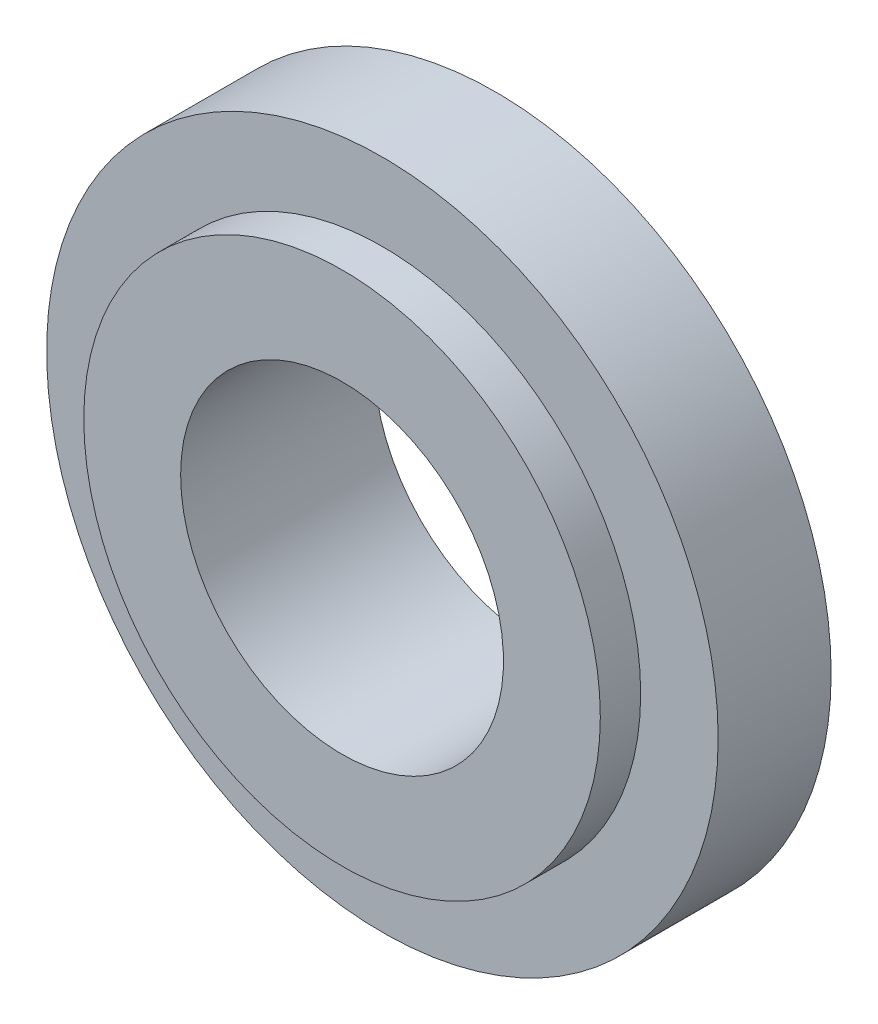
ISO-10303-21;
HEADER;
FILE_DESCRIPTION(('STEP AP214'),'2;1');
FILE_NAME('part.step','',(''),(''),'','','');
FILE_SCHEMA(('AUTOMOTIVE_DESIGN { 1 0 10303 214 1 1 1 1 }'));
ENDSEC;
DATA;
#1=APPLICATION_CONTEXT('core data for automotive mechanical design processes');
#2=APPLICATION_PROTOCOL_DEFINITION('international standard','automotive_design',2000,#1);
#3=PRODUCT_CONTEXT('',#1,'mechanical');
#4=PRODUCT('Part','Part','',(#3));
#5=PRODUCT_RELATED_PRODUCT_CATEGORY('part','',(#4));
#6=PRODUCT_DEFINITION_FORMATION('','',#4);
#7=PRODUCT_DEFINITION_CONTEXT('part definition',#1,'design');
#8=PRODUCT_DEFINITION('design','',#6,#7);
#9=PRODUCT_DEFINITION_SHAPE('','',#8);
#10=(LENGTH_UNIT() NAMED_UNIT(*) SI_UNIT(.MILLI.,.METRE.));
#11=(NAMED_UNIT(*) PLANE_ANGLE_UNIT() SI_UNIT($,.RADIAN.));
#12=(NAMED_UNIT(*) SI_UNIT($,.STERADIAN.) SOLID_ANGLE_UNIT());
#13=UNCERTAINTY_MEASURE_WITH_UNIT(LENGTH_MEASURE(1.E-05),#10,'distance_accuracy_value','');
#14=(GEOMETRIC_REPRESENTATION_CONTEXT(3) GLOBAL_UNCERTAINTY_ASSIGNED_CONTEXT((#13)) GLOBAL_UNIT_ASSIGNED_CONTEXT((#10,
#11,#12)) REPRESENTATION_CONTEXT('',''));
#15=CARTESIAN_POINT('',(0.,0.,0.));
#16=DIRECTION('',(0.,0.,1.));
#17=DIRECTION('',(1.,0.,0.));
#18=AXIS2_PLACEMENT_3D('',#15,#16,#17);
#19=CARTESIAN_POINT('',(0.,0.,9.525));
#20=DIRECTION('',(0.,0.,-1.));
#21=DIRECTION('',(-1.,0.,0.));
#22=AXIS2_PLACEMENT_3D('',#19,#20,#21);
#23=CYLINDRICAL_SURFACE('',#22,12.7);
#24=CARTESIAN_POINT('',(0.,0.,0.));
#25=DIRECTION('',(0.,0.,1.));
#26=DIRECTION('',(1.,0.,0.));
#27=AXIS2_PLACEMENT_3D('',#24,#25,#26);
#28=CIRCLE('',#27,12.7);
#29=CARTESIAN_POINT('',(-12.7,0.,0.));
#30=VERTEX_POINT('',#29);
#31=EDGE_CURVE('E41',#30,#30,#28,.T.);
#32=CARTESIAN_POINT('',(0.,0.,1.984375));
#33=DIRECTION('',(0.,0.,1.));
#34=DIRECTION('',(1.,0.,0.));
#35=AXIS2_PLACEMENT_3D('',#32,#33,#34);
#36=CIRCLE('',#35,12.7);
#37=CARTESIAN_POINT('',(-12.7,0.,1.984375));
#38=VERTEX_POINT('',#37);
#39=EDGE_CURVE('E10',#38,#38,#36,.T.);
#40=CARTESIAN_POINT('',(-12.7,0.,0.));
#41=CARTESIAN_POINT('',(-12.7,0.,0.0206705729166665));
#42=CARTESIAN_POINT('',(-12.7,0.,0.041341145833333));
#43=CARTESIAN_POINT('',(-12.7,0.,0.0826822916666665));
#44=CARTESIAN_POINT('',(-12.7,0.,0.103352864583334));
#45=CARTESIAN_POINT('',(-12.7,0.,0.144694010416667));
#46=CARTESIAN_POINT('',(-12.7,0.,0.165364583333334));
#47=CARTESIAN_POINT('',(-12.7,0.,0.206705729166667));
#48=CARTESIAN_POINT('',(-12.7,0.,0.227376302083333));
#49=CARTESIAN_POINT('',(-12.7,0.,0.268717447916667));
#50=CARTESIAN_POINT('',(-12.7,0.,0.289388020833334));
#51=CARTESIAN_POINT('',(-12.7,0.,0.330729166666667));
#52=CARTESIAN_POINT('',(-12.7,0.,0.351399739583334));
#53=CARTESIAN_POINT('',(-12.7,0.,0.392740885416667));
#54=CARTESIAN_POINT('',(-12.7,0.,0.413411458333333));
#55=CARTESIAN_POINT('',(-12.7,0.,0.454752604166666));
#56=CARTESIAN_POINT('',(-12.7,0.,0.475423177083333));
#57=CARTESIAN_POINT('',(-12.7,0.,0.516764322916666));
#58=CARTESIAN_POINT('',(-12.7,0.,0.537434895833333));
#59=CARTESIAN_POINT('',(-12.7,0.,0.578776041666667));
#60=CARTESIAN_POINT('',(-12.7,0.,0.599446614583333));
#61=CARTESIAN_POINT('',(-12.7,0.,0.640787760416666));
#62=CARTESIAN_POINT('',(-12.7,0.,0.661458333333333));
#63=CARTESIAN_POINT('',(-12.7,0.,0.702799479166666));
#64=CARTESIAN_POINT('',(-12.7,0.,0.723470052083333));
#65=CARTESIAN_POINT('',(-12.7,0.,0.764811197916667));
#66=CARTESIAN_POINT('',(-12.7,0.,0.785481770833333));
#67=CARTESIAN_POINT('',(-12.7,0.,0.826822916666666));
#68=CARTESIAN_POINT('',(-12.7,0.,0.847493489583333));
#69=CARTESIAN_POINT('',(-12.7,0.,0.888834635416666));
#70=CARTESIAN_POINT('',(-12.7,0.,0.909505208333333));
#71=CARTESIAN_POINT('',(-12.7,0.,0.950846354166667));
#72=CARTESIAN_POINT('',(-12.7,0.,0.971516927083334));
#73=CARTESIAN_POINT('',(-12.7,0.,1.01285807291667));
#74=CARTESIAN_POINT('',(-12.7,0.,1.03352864583333));
#75=CARTESIAN_POINT('',(-12.7,0.,1.07486979166667));
#76=CARTESIAN_POINT('',(-12.7,0.,1.09554036458333));
#77=CARTESIAN_POINT('',(-12.7,0.,1.13688151041667));
#78=CARTESIAN_POINT('',(-12.7,0.,1.15755208333333));
#79=CARTESIAN_POINT('',(-12.7,0.,1.19889322916667));
#80=CARTESIAN_POINT('',(-12.7,0.,1.21956380208333));
#81=CARTESIAN_POINT('',(-12.7,0.,1.26090494791667));
#82=CARTESIAN_POINT('',(-12.7,0.,1.28157552083333));
#83=CARTESIAN_POINT('',(-12.7,0.,1.32291666666667));
#84=CARTESIAN_POINT('',(-12.7,0.,1.34358723958333));
#85=CARTESIAN_POINT('',(-12.7,0.,1.38492838541667));
#86=CARTESIAN_POINT('',(-12.7,0.,1.40559895833333));
#87=CARTESIAN_POINT('',(-12.7,0.,1.44694010416667));
#88=CARTESIAN_POINT('',(-12.7,0.,1.46761067708333));
#89=CARTESIAN_POINT('',(-12.7,0.,1.50895182291667));
#90=CARTESIAN_POINT('',(-12.7,0.,1.52962239583333));
#91=CARTESIAN_POINT('',(-12.7,0.,1.57096354166667));
#92=CARTESIAN_POINT('',(-12.7,0.,1.59163411458333));
#93=CARTESIAN_POINT('',(-12.7,0.,1.63297526041667));
#94=CARTESIAN_POINT('',(-12.7,0.,1.65364583333333));
#95=CARTESIAN_POINT('',(-12.7,0.,1.69498697916667));
#96=CARTESIAN_POINT('',(-12.7,0.,1.71565755208333));
#97=CARTESIAN_POINT('',(-12.7,0.,1.75699869791667));
#98=CARTESIAN_POINT('',(-12.7,0.,1.77766927083333));
#99=CARTESIAN_POINT('',(-12.7,0.,1.81901041666667));
#100=CARTESIAN_POINT('',(-12.7,0.,1.83968098958333));
#101=CARTESIAN_POINT('',(-12.7,0.,1.88102213541667));
#102=CARTESIAN_POINT('',(-12.7,0.,1.90169270833333));
#103=CARTESIAN_POINT('',(-12.7,0.,1.94303385416667));
#104=CARTESIAN_POINT('',(-12.7,0.,1.96370442708333));
#105=CARTESIAN_POINT('',(-12.7,0.,1.984375));
#106=B_SPLINE_CURVE_WITH_KNOTS('',3,(#40,#41,#42,#43,#44,#45,#46,#47,#48,#49,#50,#51,#52,#53,
#54,#55,#56,#57,#58,#59,#60,#61,#62,#63,#64,#65,#66,#67,#68,#69,#70,#71,#72,#73,#74,#75,#76,#77,
#78,#79,#80,#81,#82,#83,#84,#85,#86,#87,#88,#89,#90,#91,#92,#93,#94,#95,#96,#97,#98,#99,#100,
#101,#102,#103,#104,#105),.UNSPECIFIED.,.F.,.F.,(4,2,2,2,2,2,2,2,2,2,2,2,2,2,2,2,2,2,2,2,2,2,2,
2,2,2,2,2,2,2,2,2,4),(0.,0.0620117187499995,0.124023437500001,0.18603515625,0.248046875,
0.310058593750001,0.3720703125,0.43408203125,0.496093749999999,0.55810546875,0.6201171875,
0.682128906249999,0.744140625,0.80615234375,0.868164062499999,0.930175781250001,0.9921875,
1.05419921875,1.1162109375,1.17822265625,1.240234375,1.30224609375,1.3642578125,1.42626953125,
1.48828125,1.55029296875,1.6123046875,1.67431640625,1.736328125,1.79833984375,1.8603515625,
1.92236328125,1.984375),.UNSPECIFIED.);
#107=EDGE_CURVE('BSEAM37',#30,#38,#106,.T.);
#108=ORIENTED_EDGE('',*,*,#31,.T.);
#109=ORIENTED_EDGE('',*,*,#39,.F.);
#110=ORIENTED_EDGE('',*,*,#107,.T.);
#111=ORIENTED_EDGE('',*,*,#107,.F.);
#112=EDGE_LOOP('',(#108,#110,#109,#111));
#113=FACE_BOUND('',#112,.T.);
#114=ADVANCED_FACE('F37',(#113),#23,.T.);
#115=CARTESIAN_POINT('',(0.,0.,9.525));
#116=DIRECTION('',(0.,0.,1.));
#117=DIRECTION('',(1.,0.,0.));
#118=AXIS2_PLACEMENT_3D('',#115,#116,#117);
#119=PLANE('',#118);
#120=CARTESIAN_POINT('',(0.,0.,9.525));
#121=DIRECTION('',(0.,0.,1.));
#122=DIRECTION('',(1.,0.,0.));
#123=AXIS2_PLACEMENT_3D('',#120,#121,#122);
#124=CIRCLE('',#123,12.7);
#125=CARTESIAN_POINT('',(-12.7,0.,9.525));
#126=VERTEX_POINT('',#125);
#127=EDGE_CURVE('E45',#126,#126,#124,.T.);
#128=ORIENTED_EDGE('',*,*,#127,.T.);
#129=EDGE_LOOP('',(#128));
#130=FACE_BOUND('',#129,.T.);
#131=CARTESIAN_POINT('',(0.,0.,9.525));
#132=DIRECTION('',(0.,0.,1.));
#133=DIRECTION('',(1.,0.,0.));
#134=AXIS2_PLACEMENT_3D('',#131,#132,#133);
#135=CIRCLE('',#134,7.9375);
#136=CARTESIAN_POINT('',(-7.9375,0.,9.525));
#137=VERTEX_POINT('',#136);
#138=EDGE_CURVE('E59',#137,#137,#135,.T.);
#139=ORIENTED_EDGE('',*,*,#138,.F.);
#140=EDGE_LOOP('',(#139));
#141=FACE_BOUND('',#140,.T.);
#142=ADVANCED_FACE('F83',(#130,#141),#119,.T.);
#143=CARTESIAN_POINT('',(0.,0.,0.));
#144=DIRECTION('',(0.,0.,1.));
#145=DIRECTION('',(1.,0.,0.));
#146=AXIS2_PLACEMENT_3D('',#143,#144,#145);
#147=PLANE('',#146);
#148=ORIENTED_EDGE('',*,*,#31,.F.);
#149=EDGE_LOOP('',(#148));
#150=FACE_BOUND('',#149,.T.);
#151=CARTESIAN_POINT('',(0.,0.,0.));
#152=DIRECTION('',(0.,0.,1.));
#153=DIRECTION('',(1.,0.,0.));
#154=AXIS2_PLACEMENT_3D('',#151,#152,#153);
#155=CIRCLE('',#154,7.9375);
#156=CARTESIAN_POINT('',(-7.9375,0.,0.));
#157=VERTEX_POINT('',#156);
#158=EDGE_CURVE('E57',#157,#157,#155,.T.);
#159=ORIENTED_EDGE('',*,*,#158,.T.);
#160=EDGE_LOOP('',(#159));
#161=FACE_BOUND('',#160,.T.);
#162=ADVANCED_FACE('F65',(#150,#161),#147,.F.);
#163=CARTESIAN_POINT('',(0.,0.,7.540625));
#164=DIRECTION('',(0.,0.,1.));
#165=DIRECTION('',(1.,0.,0.));
#166=AXIS2_PLACEMENT_3D('',#163,#164,#165);
#167=CIRCLE('',#166,12.7);
#168=CARTESIAN_POINT('',(-12.7,0.,7.540625));
#169=VERTEX_POINT('',#168);
#170=EDGE_CURVE('E54',#169,#169,#167,.T.);
#171=CARTESIAN_POINT('',(-12.7,0.,7.540625));
#172=CARTESIAN_POINT('',(-12.7,0.,7.56129557291667));
#173=CARTESIAN_POINT('',(-12.7,0.,7.58196614583333));
#174=CARTESIAN_POINT('',(-12.7,0.,7.62330729166667));
#175=CARTESIAN_POINT('',(-12.7,0.,7.64397786458333));
#176=CARTESIAN_POINT('',(-12.7,0.,7.68531901041667));
#177=CARTESIAN_POINT('',(-12.7,0.,7.70598958333333));
#178=CARTESIAN_POINT('',(-12.7,0.,7.74733072916667));
#179=CARTESIAN_POINT('',(-12.7,0.,7.76800130208333));
#180=CARTESIAN_POINT('',(-12.7,0.,7.80934244791667));
#181=CARTESIAN_POINT('',(-12.7,0.,7.83001302083333));
#182=CARTESIAN_POINT('',(-12.7,0.,7.87135416666667));
#183=CARTESIAN_POINT('',(-12.7,0.,7.89202473958333));
#184=CARTESIAN_POINT('',(-12.7,0.,7.93336588541667));
#185=CARTESIAN_POINT('',(-12.7,0.,7.95403645833333));
#186=CARTESIAN_POINT('',(-12.7,0.,7.99537760416667));
#187=CARTESIAN_POINT('',(-12.7,0.,8.01604817708333));
#188=CARTESIAN_POINT('',(-12.7,0.,8.05738932291666));
#189=CARTESIAN_POINT('',(-12.7,0.,8.07805989583333));
#190=CARTESIAN_POINT('',(-12.7,0.,8.11940104166667));
#191=CARTESIAN_POINT('',(-12.7,0.,8.14007161458333));
#192=CARTESIAN_POINT('',(-12.7,0.,8.18141276041667));
#193=CARTESIAN_POINT('',(-12.7,0.,8.20208333333333));
#194=CARTESIAN_POINT('',(-12.7,0.,8.24342447916667));
#195=CARTESIAN_POINT('',(-12.7,0.,8.26409505208333));
#196=CARTESIAN_POINT('',(-12.7,0.,8.30543619791667));
#197=CARTESIAN_POINT('',(-12.7,0.,8.32610677083333));
#198=CARTESIAN_POINT('',(-12.7,0.,8.36744791666667));
#199=CARTESIAN_POINT('',(-12.7,0.,8.38811848958333));
#200=CARTESIAN_POINT('',(-12.7,0.,8.42945963541667));
#201=CARTESIAN_POINT('',(-12.7,0.,8.45013020833333));
#202=CARTESIAN_POINT('',(-12.7,0.,8.49147135416667));
#203=CARTESIAN_POINT('',(-12.7,0.,8.51214192708333));
#204=CARTESIAN_POINT('',(-12.7,0.,8.55348307291667));
#205=CARTESIAN_POINT('',(-12.7,0.,8.57415364583333));
#206=CARTESIAN_POINT('',(-12.7,0.,8.61549479166667));
#207=CARTESIAN_POINT('',(-12.7,0.,8.63616536458333));
#208=CARTESIAN_POINT('',(-12.7,0.,8.67750651041667));
#209=CARTESIAN_POINT('',(-12.7,0.,8.69817708333333));
#210=CARTESIAN_POINT('',(-12.7,0.,8.73951822916667));
#211=CARTESIAN_POINT('',(-12.7,0.,8.76018880208333));
#212=CARTESIAN_POINT('',(-12.7,0.,8.80152994791667));
#213=CARTESIAN_POINT('',(-12.7,0.,8.82220052083333));
#214=CARTESIAN_POINT('',(-12.7,0.,8.86354166666666));
#215=CARTESIAN_POINT('',(-12.7,0.,8.88421223958333));
#216=CARTESIAN_POINT('',(-12.7,0.,8.92555338541667));
#217=CARTESIAN_POINT('',(-12.7,0.,8.94622395833333));
#218=CARTESIAN_POINT('',(-12.7,0.,8.98756510416667));
#219=CARTESIAN_POINT('',(-12.7,0.,9.00823567708333));
#220=CARTESIAN_POINT('',(-12.7,0.,9.04957682291666));
#221=CARTESIAN_POINT('',(-12.7,0.,9.07024739583333));
#222=CARTESIAN_POINT('',(-12.7,0.,9.11158854166667));
#223=CARTESIAN_POINT('',(-12.7,0.,9.13225911458333));
#224=CARTESIAN_POINT('',(-12.7,0.,9.17360026041667));
#225=CARTESIAN_POINT('',(-12.7,0.,9.19427083333333));
#226=CARTESIAN_POINT('',(-12.7,0.,9.23561197916667));
#227=CARTESIAN_POINT('',(-12.7,0.,9.25628255208333));
#228=CARTESIAN_POINT('',(-12.7,0.,9.29762369791667));
#229=CARTESIAN_POINT('',(-12.7,0.,9.31829427083333));
#230=CARTESIAN_POINT('',(-12.7,0.,9.35963541666667));
#231=CARTESIAN_POINT('',(-12.7,0.,9.38030598958333));
#232=CARTESIAN_POINT('',(-12.7,0.,9.42164713541667));
#233=CARTESIAN_POINT('',(-12.7,0.,9.44231770833333));
#234=CARTESIAN_POINT('',(-12.7,0.,9.48365885416667));
#235=CARTESIAN_POINT('',(-12.7,0.,9.50432942708333));
#236=CARTESIAN_POINT('',(-12.7,0.,9.525));
#237=B_SPLINE_CURVE_WITH_KNOTS('',3,(#171,#172,#173,#174,#175,#176,#177,#178,#179,#180,#181,
#182,#183,#184,#185,#186,#187,#188,#189,#190,#191,#192,#193,#194,#195,#196,#197,#198,#199,#200,
#201,#202,#203,#204,#205,#206,#207,#208,#209,#210,#211,#212,#213,#214,#215,#216,#217,#218,#219,
#220,#221,#222,#223,#224,#225,#226,#227,#228,#229,#230,#231,#232,#233,#234,#235,#236),
.UNSPECIFIED.,.F.,.F.,(4,2,2,2,2,2,2,2,2,2,2,2,2,2,2,2,2,2,2,2,2,2,2,2,2,2,2,2,2,2,2,2,4),(0.,
0.0620117187499995,0.124023437499999,0.186035156249999,0.248046875,0.310058593749999,
0.372070312499999,0.43408203125,0.496093749999999,0.558105468749999,0.6201171875,
0.682128906249999,0.744140624999999,0.80615234375,0.868164062499999,0.930175781249999,0.9921875,
1.05419921875,1.1162109375,1.17822265625,1.240234375,1.30224609375,1.3642578125,1.42626953125,
1.48828125,1.55029296875,1.6123046875,1.67431640625,1.736328125,1.79833984375,1.8603515625,
1.92236328125,1.984375),.UNSPECIFIED.);
#238=EDGE_CURVE('BSEAM39',#169,#126,#237,.T.);
#239=ORIENTED_EDGE('',*,*,#170,.T.);
#240=ORIENTED_EDGE('',*,*,#127,.F.);
#241=ORIENTED_EDGE('',*,*,#238,.T.);
#242=ORIENTED_EDGE('',*,*,#238,.F.);
#243=EDGE_LOOP('',(#239,#241,#240,#242));
#244=FACE_BOUND('',#243,.T.);
#245=ADVANCED_FACE('F39',(#244),#23,.T.);
#246=CARTESIAN_POINT('',(0.,0.,9.525));
#247=DIRECTION('',(0.,0.,-1.));
#248=DIRECTION('',(-1.,0.,0.));
#249=AXIS2_PLACEMENT_3D('',#246,#247,#248);
#250=CYLINDRICAL_SURFACE('',#249,7.9375);
#251=CARTESIAN_POINT('',(-7.9375,0.,9.525));
#252=CARTESIAN_POINT('',(-7.9375,0.,9.42578125));
#253=CARTESIAN_POINT('',(-7.9375,0.,9.3265625));
#254=CARTESIAN_POINT('',(-7.9375,0.,9.128125));
#255=CARTESIAN_POINT('',(-7.9375,0.,9.02890625));
#256=CARTESIAN_POINT('',(-7.9375,0.,8.83046875));
#257=CARTESIAN_POINT('',(-7.9375,0.,8.73125));
#258=CARTESIAN_POINT('',(-7.9375,0.,8.5328125));
#259=CARTESIAN_POINT('',(-7.9375,0.,8.43359375));
#260=CARTESIAN_POINT('',(-7.9375,0.,8.23515625));
#261=CARTESIAN_POINT('',(-7.9375,0.,8.1359375));
#262=CARTESIAN_POINT('',(-7.9375,0.,7.9375));
#263=CARTESIAN_POINT('',(-7.9375,0.,7.83828125));
#264=CARTESIAN_POINT('',(-7.9375,0.,7.63984375));
#265=CARTESIAN_POINT('',(-7.9375,0.,7.540625));
#266=CARTESIAN_POINT('',(-7.9375,0.,7.3421875));
#267=CARTESIAN_POINT('',(-7.9375,0.,7.24296875));
#268=CARTESIAN_POINT('',(-7.9375,0.,7.04453125));
#269=CARTESIAN_POINT('',(-7.9375,0.,6.9453125));
#270=CARTESIAN_POINT('',(-7.9375,0.,6.746875));
#271=CARTESIAN_POINT('',(-7.9375,0.,6.64765625));
#272=CARTESIAN_POINT('',(-7.9375,0.,6.44921875));
#273=CARTESIAN_POINT('',(-7.9375,0.,6.35));
#274=CARTESIAN_POINT('',(-7.9375,0.,6.1515625));
#275=CARTESIAN_POINT('',(-7.9375,0.,6.05234375));
#276=CARTESIAN_POINT('',(-7.9375,0.,5.85390625));
#277=CARTESIAN_POINT('',(-7.9375,0.,5.7546875));
#278=CARTESIAN_POINT('',(-7.9375,0.,5.55625));
#279=CARTESIAN_POINT('',(-7.9375,0.,5.45703125));
#280=CARTESIAN_POINT('',(-7.9375,0.,5.25859375));
#281=CARTESIAN_POINT('',(-7.9375,0.,5.159375));
#282=CARTESIAN_POINT('',(-7.9375,0.,4.9609375));
#283=CARTESIAN_POINT('',(-7.9375,0.,4.86171875));
#284=CARTESIAN_POINT('',(-7.9375,0.,4.66328125));
#285=CARTESIAN_POINT('',(-7.9375,0.,4.5640625));
#286=CARTESIAN_POINT('',(-7.9375,0.,4.365625));
#287=CARTESIAN_POINT('',(-7.9375,0.,4.26640625));
#288=CARTESIAN_POINT('',(-7.9375,0.,4.06796875));
#289=CARTESIAN_POINT('',(-7.9375,0.,3.96875));
#290=CARTESIAN_POINT('',(-7.9375,0.,3.7703125));
#291=CARTESIAN_POINT('',(-7.9375,0.,3.67109375));
#292=CARTESIAN_POINT('',(-7.9375,0.,3.47265625));
#293=CARTESIAN_POINT('',(-7.9375,0.,3.3734375));
#294=CARTESIAN_POINT('',(-7.9375,0.,3.175));
#295=CARTESIAN_POINT('',(-7.9375,0.,3.07578125));
#296=CARTESIAN_POINT('',(-7.9375,0.,2.87734375));
#297=CARTESIAN_POINT('',(-7.9375,0.,2.778125));
#298=CARTESIAN_POINT('',(-7.9375,0.,2.5796875));
#299=CARTESIAN_POINT('',(-7.9375,0.,2.48046875));
#300=CARTESIAN_POINT('',(-7.9375,0.,2.28203125));
#301=CARTESIAN_POINT('',(-7.9375,0.,2.1828125));
#302=CARTESIAN_POINT('',(-7.9375,0.,1.984375));
#303=CARTESIAN_POINT('',(-7.9375,0.,1.88515625));
#304=CARTESIAN_POINT('',(-7.9375,0.,1.68671875));
#305=CARTESIAN_POINT('',(-7.9375,0.,1.5875));
#306=CARTESIAN_POINT('',(-7.9375,0.,1.3890625));
#307=CARTESIAN_POINT('',(-7.9375,0.,1.28984375));
#308=CARTESIAN_POINT('',(-7.9375,0.,1.09140625));
#309=CARTESIAN_POINT('',(-7.9375,0.,0.992187500000001));
#310=CARTESIAN_POINT('',(-7.9375,0.,0.793750000000001));
#311=CARTESIAN_POINT('',(-7.9375,0.,0.69453125));
#312=CARTESIAN_POINT('',(-7.9375,0.,0.49609375));
#313=CARTESIAN_POINT('',(-7.9375,0.,0.396875));
#314=CARTESIAN_POINT('',(-7.9375,0.,0.1984375));
#315=CARTESIAN_POINT('',(-7.9375,0.,0.0992187500000001));
#316=CARTESIAN_POINT('',(-7.9375,0.,0.));
#317=B_SPLINE_CURVE_WITH_KNOTS('',3,(#251,#252,#253,#254,#255,#256,#257,#258,#259,#260,#261,
#262,#263,#264,#265,#266,#267,#268,#269,#270,#271,#272,#273,#274,#275,#276,#277,#278,#279,#280,
#281,#282,#283,#284,#285,#286,#287,#288,#289,#290,#291,#292,#293,#294,#295,#296,#297,#298,#299,
#300,#301,#302,#303,#304,#305,#306,#307,#308,#309,#310,#311,#312,#313,#314,#315,#316),
.UNSPECIFIED.,.F.,.F.,(4,2,2,2,2,2,2,2,2,2,2,2,2,2,2,2,2,2,2,2,2,2,2,2,2,2,2,2,2,2,2,2,4),(0.,
0.297656249999998,0.595312499999999,0.892968749999999,1.190625,1.48828125,1.7859375,2.08359375,
2.38125,2.67890625,2.9765625,3.27421875,3.571875,3.86953125,4.1671875,4.46484375,4.7625,
5.06015625,5.3578125,5.65546875,5.953125,6.25078125,6.5484375,6.84609375,7.14375,7.44140625,
7.7390625,8.03671875,8.334375,8.63203125,8.9296875,9.22734375,9.525),.UNSPECIFIED.);
#318=EDGE_CURVE('BSEAM67',#137,#157,#317,.T.);
#319=ORIENTED_EDGE('',*,*,#138,.T.);
#320=ORIENTED_EDGE('',*,*,#158,.F.);
#321=ORIENTED_EDGE('',*,*,#318,.T.);
#322=ORIENTED_EDGE('',*,*,#318,.F.);
#323=EDGE_LOOP('',(#319,#321,#320,#322));
#324=FACE_BOUND('',#323,.T.);
#325=ADVANCED_FACE('F67',(#324),#250,.F.);
#326=CARTESIAN_POINT('',(0.,0.,7.540625));
#327=DIRECTION('',(0.,0.,1.));
#328=DIRECTION('',(1.,0.,0.));
#329=AXIS2_PLACEMENT_3D('',#326,#327,#328);
#330=PLANE('',#329);
#331=CARTESIAN_POINT('',(0.,0.,7.540625));
#332=DIRECTION('',(0.,0.,1.));
#333=DIRECTION('',(1.,0.,0.));
#334=AXIS2_PLACEMENT_3D('',#331,#332,#333);
#335=CIRCLE('',#334,16.51);
#336=CARTESIAN_POINT('',(16.51,0.,7.540625));
#337=VERTEX_POINT('',#336);
#338=EDGE_CURVE('E58',#337,#337,#335,.T.);
#339=ORIENTED_EDGE('',*,*,#338,.T.);
#340=EDGE_LOOP('',(#339));
#341=FACE_BOUND('',#340,.T.);
#342=ORIENTED_EDGE('',*,*,#170,.F.);
#343=EDGE_LOOP('',(#342));
#344=FACE_BOUND('',#343,.T.);
#345=ADVANCED_FACE('F69',(#341,#344),#330,.T.);
#346=CARTESIAN_POINT('',(0.,0.,1.984375));
#347=DIRECTION('',(0.,0.,1.));
#348=DIRECTION('',(1.,0.,0.));
#349=AXIS2_PLACEMENT_3D('',#346,#347,#348);
#350=PLANE('',#349);
#351=CARTESIAN_POINT('',(0.,0.,1.984375));
#352=DIRECTION('',(0.,0.,1.));
#353=DIRECTION('',(1.,0.,0.));
#354=AXIS2_PLACEMENT_3D('',#351,#352,#353);
#355=CIRCLE('',#354,16.51);
#356=CARTESIAN_POINT('',(16.51,0.,1.984375));
#357=VERTEX_POINT('',#356);
#358=EDGE_CURVE('E52',#357,#357,#355,.T.);
#359=ORIENTED_EDGE('',*,*,#358,.F.);
#360=EDGE_LOOP('',(#359));
#361=FACE_BOUND('',#360,.T.);
#362=ORIENTED_EDGE('',*,*,#39,.T.);
#363=EDGE_LOOP('',(#362));
#364=FACE_BOUND('',#363,.T.);
#365=ADVANCED_FACE('F76',(#361,#364),#350,.F.);
#366=CARTESIAN_POINT('',(0.,0.,7.540625));
#367=DIRECTION('',(0.,0.,-1.));
#368=DIRECTION('',(-1.,0.,0.));
#369=AXIS2_PLACEMENT_3D('',#366,#367,#368);
#370=CYLINDRICAL_SURFACE('',#369,16.51);
#371=ORIENTED_EDGE('',*,*,#338,.F.);
#372=EDGE_LOOP('',(#371));
#373=FACE_BOUND('',#372,.T.);
#374=ORIENTED_EDGE('',*,*,#358,.T.);
#375=EDGE_LOOP('',(#374));
#376=FACE_BOUND('',#375,.T.);
#377=ADVANCED_FACE('F129',(#373,#376),#370,.T.);
#378=CLOSED_SHELL('',(#114,#142,#162,#245,#325,#345,#365,#377));
#379=MANIFOLD_SOLID_BREP('B2',#378);
#380=ADVANCED_BREP_SHAPE_REPRESENTATION('',(#18,#379),#14);
#381=SHAPE_DEFINITION_REPRESENTATION(#9,#380);
ENDSEC;
END-ISO-10303-21;
